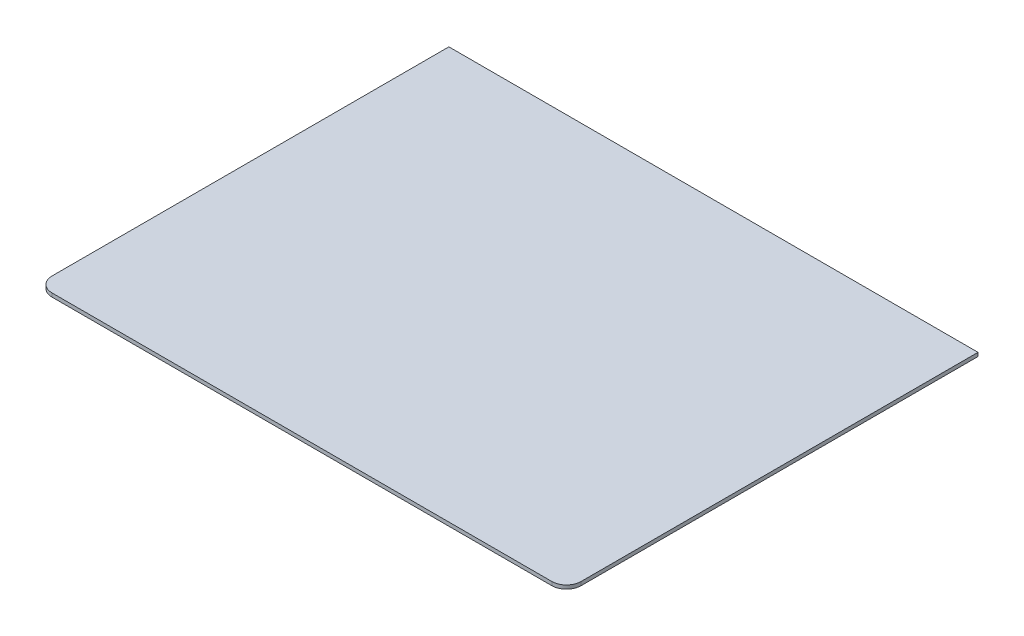
ISO-10303-21;
HEADER;
FILE_DESCRIPTION(('STEP AP214'),'2;1');
FILE_NAME('part.step','',(''),(''),'','','');
FILE_SCHEMA(('AUTOMOTIVE_DESIGN { 1 0 10303 214 1 1 1 1 }'));
ENDSEC;
DATA;
#1=APPLICATION_CONTEXT('core data for automotive mechanical design processes');
#2=APPLICATION_PROTOCOL_DEFINITION('international standard','automotive_design',2000,#1);
#3=PRODUCT_CONTEXT('',#1,'mechanical');
#4=PRODUCT('Part','Part','',(#3));
#5=PRODUCT_RELATED_PRODUCT_CATEGORY('part','',(#4));
#6=PRODUCT_DEFINITION_FORMATION('','',#4);
#7=PRODUCT_DEFINITION_CONTEXT('part definition',#1,'design');
#8=PRODUCT_DEFINITION('design','',#6,#7);
#9=PRODUCT_DEFINITION_SHAPE('','',#8);
#10=(LENGTH_UNIT() NAMED_UNIT(*) SI_UNIT(.MILLI.,.METRE.));
#11=(NAMED_UNIT(*) PLANE_ANGLE_UNIT() SI_UNIT($,.RADIAN.));
#12=(NAMED_UNIT(*) SI_UNIT($,.STERADIAN.) SOLID_ANGLE_UNIT());
#13=UNCERTAINTY_MEASURE_WITH_UNIT(LENGTH_MEASURE(1.E-05),#10,'distance_accuracy_value','');
#14=(GEOMETRIC_REPRESENTATION_CONTEXT(3) GLOBAL_UNCERTAINTY_ASSIGNED_CONTEXT((#13)) GLOBAL_UNIT_ASSIGNED_CONTEXT((#10,
#11,#12)) REPRESENTATION_CONTEXT('',''));
#15=CARTESIAN_POINT('',(0.,0.,0.));
#16=DIRECTION('',(0.,0.,1.));
#17=DIRECTION('',(1.,0.,0.));
#18=AXIS2_PLACEMENT_3D('',#15,#16,#17);
#19=CARTESIAN_POINT('',(228.6,3.175,177.8));
#20=DIRECTION('',(-1.,0.,0.));
#21=DIRECTION('',(0.,0.,1.));
#22=AXIS2_PLACEMENT_3D('',#19,#20,#21);
#23=PLANE('',#22);
#24=DIRECTION('',(0.,0.,-1.));
#25=VECTOR('',#24,1.);
#26=CARTESIAN_POINT('',(228.6,3.175,177.8));
#27=LINE('',#26,#25);
#28=CARTESIAN_POINT('',(228.6,3.175,165.1));
#29=VERTEX_POINT('',#28);
#30=CARTESIAN_POINT('',(228.6,3.175,-177.8));
#31=VERTEX_POINT('',#30);
#32=EDGE_CURVE('E93',#29,#31,#27,.T.);
#33=ORIENTED_EDGE('',*,*,#32,.F.);
#34=DIRECTION('',(0.,-1.,0.));
#35=VECTOR('',#34,1.);
#36=CARTESIAN_POINT('',(228.6,3.175,165.1));
#37=LINE('',#36,#35);
#38=CARTESIAN_POINT('',(228.6,0.,165.1));
#39=VERTEX_POINT('',#38);
#40=EDGE_CURVE('E11',#29,#39,#37,.T.);
#41=ORIENTED_EDGE('',*,*,#40,.T.);
#42=DIRECTION('',(0.,0.,-1.));
#43=VECTOR('',#42,1.);
#44=CARTESIAN_POINT('',(228.6,0.,177.8));
#45=LINE('',#44,#43);
#46=CARTESIAN_POINT('',(228.6,0.,-177.8));
#47=VERTEX_POINT('',#46);
#48=EDGE_CURVE('E114',#39,#47,#45,.T.);
#49=ORIENTED_EDGE('',*,*,#48,.T.);
#50=DIRECTION('',(0.,-1.,0.));
#51=VECTOR('',#50,1.);
#52=CARTESIAN_POINT('',(228.6,3.175,-177.8));
#53=LINE('',#52,#51);
#54=EDGE_CURVE('E107',#31,#47,#53,.T.);
#55=ORIENTED_EDGE('',*,*,#54,.F.);
#56=EDGE_LOOP('',(#33,#41,#49,#55));
#57=FACE_BOUND('',#56,.T.);
#58=ADVANCED_FACE('F39',(#57),#23,.F.);
#59=CARTESIAN_POINT('',(-228.6,3.175,-177.8));
#60=DIRECTION('',(0.,0.,1.));
#61=DIRECTION('',(1.,0.,0.));
#62=AXIS2_PLACEMENT_3D('',#59,#60,#61);
#63=PLANE('',#62);
#64=DIRECTION('',(-1.,0.,0.));
#65=VECTOR('',#64,1.);
#66=CARTESIAN_POINT('',(-228.6,0.,-177.8));
#67=LINE('',#66,#65);
#68=CARTESIAN_POINT('',(-228.6,0.,-177.8));
#69=VERTEX_POINT('',#68);
#70=EDGE_CURVE('E158',#47,#69,#67,.T.);
#71=ORIENTED_EDGE('',*,*,#70,.T.);
#72=DIRECTION('',(0.,-1.,0.));
#73=VECTOR('',#72,1.);
#74=CARTESIAN_POINT('',(-228.6,3.175,-177.8));
#75=LINE('',#74,#73);
#76=CARTESIAN_POINT('',(-228.6,3.175,-177.8));
#77=VERTEX_POINT('',#76);
#78=EDGE_CURVE('E109',#77,#69,#75,.T.);
#79=ORIENTED_EDGE('',*,*,#78,.F.);
#80=DIRECTION('',(-1.,0.,0.));
#81=VECTOR('',#80,1.);
#82=CARTESIAN_POINT('',(-228.6,3.175,-177.8));
#83=LINE('',#82,#81);
#84=EDGE_CURVE('E96',#31,#77,#83,.T.);
#85=ORIENTED_EDGE('',*,*,#84,.F.);
#86=ORIENTED_EDGE('',*,*,#54,.T.);
#87=EDGE_LOOP('',(#71,#79,#85,#86));
#88=FACE_BOUND('',#87,.T.);
#89=ADVANCED_FACE('F106',(#88),#63,.F.);
#90=CARTESIAN_POINT('',(-228.6,3.175,177.8));
#91=DIRECTION('',(1.,0.,0.));
#92=DIRECTION('',(0.,0.,-1.));
#93=AXIS2_PLACEMENT_3D('',#90,#91,#92);
#94=PLANE('',#93);
#95=DIRECTION('',(0.,0.,1.));
#96=VECTOR('',#95,1.);
#97=CARTESIAN_POINT('',(-228.6,0.,177.8));
#98=LINE('',#97,#96);
#99=CARTESIAN_POINT('',(-228.6,0.,165.1));
#100=VERTEX_POINT('',#99);
#101=EDGE_CURVE('E155',#69,#100,#98,.T.);
#102=ORIENTED_EDGE('',*,*,#101,.T.);
#103=DIRECTION('',(0.,-1.,0.));
#104=VECTOR('',#103,1.);
#105=CARTESIAN_POINT('',(-228.6,3.175,165.1));
#106=LINE('',#105,#104);
#107=CARTESIAN_POINT('',(-228.6,3.175,165.1));
#108=VERTEX_POINT('',#107);
#109=EDGE_CURVE('E63',#100,#108,#106,.F.);
#110=ORIENTED_EDGE('',*,*,#109,.T.);
#111=DIRECTION('',(0.,0.,1.));
#112=VECTOR('',#111,1.);
#113=CARTESIAN_POINT('',(-228.6,3.175,177.8));
#114=LINE('',#113,#112);
#115=EDGE_CURVE('E111',#77,#108,#114,.T.);
#116=ORIENTED_EDGE('',*,*,#115,.F.);
#117=ORIENTED_EDGE('',*,*,#78,.T.);
#118=EDGE_LOOP('',(#102,#110,#116,#117));
#119=FACE_BOUND('',#118,.T.);
#120=ADVANCED_FACE('F156',(#119),#94,.F.);
#121=CARTESIAN_POINT('',(-228.6,3.175,177.8));
#122=DIRECTION('',(0.,0.,-1.));
#123=DIRECTION('',(-1.,0.,0.));
#124=AXIS2_PLACEMENT_3D('',#121,#122,#123);
#125=PLANE('',#124);
#126=DIRECTION('',(1.,0.,0.));
#127=VECTOR('',#126,1.);
#128=CARTESIAN_POINT('',(-228.6,3.175,177.8));
#129=LINE('',#128,#127);
#130=CARTESIAN_POINT('',(-215.9,3.175,177.8));
#131=VERTEX_POINT('',#130);
#132=CARTESIAN_POINT('',(215.9,3.175,177.8));
#133=VERTEX_POINT('',#132);
#134=EDGE_CURVE('E123',#131,#133,#129,.T.);
#135=ORIENTED_EDGE('',*,*,#134,.F.);
#136=DIRECTION('',(0.,-1.,0.));
#137=VECTOR('',#136,1.);
#138=CARTESIAN_POINT('',(-215.9,3.175,177.8));
#139=LINE('',#138,#137);
#140=CARTESIAN_POINT('',(-215.9,0.,177.8));
#141=VERTEX_POINT('',#140);
#142=EDGE_CURVE('E121',#131,#141,#139,.T.);
#143=ORIENTED_EDGE('',*,*,#142,.T.);
#144=DIRECTION('',(1.,0.,0.));
#145=VECTOR('',#144,1.);
#146=CARTESIAN_POINT('',(-228.6,0.,177.8));
#147=LINE('',#146,#145);
#148=CARTESIAN_POINT('',(215.9,0.,177.8));
#149=VERTEX_POINT('',#148);
#150=EDGE_CURVE('E102',#141,#149,#147,.T.);
#151=ORIENTED_EDGE('',*,*,#150,.T.);
#152=DIRECTION('',(0.,-1.,0.));
#153=VECTOR('',#152,1.);
#154=CARTESIAN_POINT('',(215.9,3.175,177.8));
#155=LINE('',#154,#153);
#156=EDGE_CURVE('E117',#149,#133,#155,.F.);
#157=ORIENTED_EDGE('',*,*,#156,.T.);
#158=EDGE_LOOP('',(#135,#143,#151,#157));
#159=FACE_BOUND('',#158,.T.);
#160=ADVANCED_FACE('F145',(#159),#125,.F.);
#161=CARTESIAN_POINT('',(0.,3.175,0.));
#162=DIRECTION('',(0.,-1.,0.));
#163=DIRECTION('',(0.,0.,-1.));
#164=AXIS2_PLACEMENT_3D('',#161,#162,#163);
#165=PLANE('',#164);
#166=ORIENTED_EDGE('',*,*,#115,.T.);
#167=CARTESIAN_POINT('',(-215.9,3.175,165.1));
#168=DIRECTION('',(0.,-1.,0.));
#169=DIRECTION('',(0.,0.,-1.));
#170=AXIS2_PLACEMENT_3D('',#167,#168,#169);
#171=CIRCLE('',#170,12.7);
#172=EDGE_CURVE('E48',#108,#131,#171,.F.);
#173=ORIENTED_EDGE('',*,*,#172,.T.);
#174=ORIENTED_EDGE('',*,*,#134,.T.);
#175=CARTESIAN_POINT('',(215.9,3.175,165.1));
#176=DIRECTION('',(0.,-1.,0.));
#177=DIRECTION('',(0.,0.,-1.));
#178=AXIS2_PLACEMENT_3D('',#175,#176,#177);
#179=CIRCLE('',#178,12.7);
#180=EDGE_CURVE('E55',#133,#29,#179,.F.);
#181=ORIENTED_EDGE('',*,*,#180,.T.);
#182=ORIENTED_EDGE('',*,*,#32,.T.);
#183=ORIENTED_EDGE('',*,*,#84,.T.);
#184=EDGE_LOOP('',(#166,#173,#174,#181,#182,#183));
#185=FACE_BOUND('',#184,.T.);
#186=ADVANCED_FACE('F95',(#185),#165,.F.);
#187=CARTESIAN_POINT('',(0.,0.,0.));
#188=DIRECTION('',(0.,-1.,0.));
#189=DIRECTION('',(0.,0.,-1.));
#190=AXIS2_PLACEMENT_3D('',#187,#188,#189);
#191=PLANE('',#190);
#192=ORIENTED_EDGE('',*,*,#150,.F.);
#193=CARTESIAN_POINT('',(-215.9,0.,165.1));
#194=DIRECTION('',(0.,-1.,0.));
#195=DIRECTION('',(0.,0.,-1.));
#196=AXIS2_PLACEMENT_3D('',#193,#194,#195);
#197=CIRCLE('',#196,12.7);
#198=EDGE_CURVE('E133',#141,#100,#197,.T.);
#199=ORIENTED_EDGE('',*,*,#198,.T.);
#200=ORIENTED_EDGE('',*,*,#101,.F.);
#201=ORIENTED_EDGE('',*,*,#70,.F.);
#202=ORIENTED_EDGE('',*,*,#48,.F.);
#203=CARTESIAN_POINT('',(215.9,0.,165.1));
#204=DIRECTION('',(0.,-1.,0.));
#205=DIRECTION('',(0.,0.,-1.));
#206=AXIS2_PLACEMENT_3D('',#203,#204,#205);
#207=CIRCLE('',#206,12.7);
#208=EDGE_CURVE('E130',#39,#149,#207,.T.);
#209=ORIENTED_EDGE('',*,*,#208,.T.);
#210=EDGE_LOOP('',(#192,#199,#200,#201,#202,#209));
#211=FACE_BOUND('',#210,.T.);
#212=ADVANCED_FACE('F154',(#211),#191,.T.);
#213=CARTESIAN_POINT('',(-215.9,3.175,165.1));
#214=DIRECTION('',(0.,-1.,0.));
#215=DIRECTION('',(0.,0.,-1.));
#216=AXIS2_PLACEMENT_3D('',#213,#214,#215);
#217=CYLINDRICAL_SURFACE('',#216,12.7);
#218=ORIENTED_EDGE('',*,*,#172,.F.);
#219=ORIENTED_EDGE('',*,*,#109,.F.);
#220=ORIENTED_EDGE('',*,*,#198,.F.);
#221=ORIENTED_EDGE('',*,*,#142,.F.);
#222=EDGE_LOOP('',(#218,#219,#220,#221));
#223=FACE_BOUND('',#222,.T.);
#224=ADVANCED_FACE('F151',(#223),#217,.T.);
#225=CARTESIAN_POINT('',(215.9,3.175,165.1));
#226=DIRECTION('',(0.,-1.,0.));
#227=DIRECTION('',(0.,0.,-1.));
#228=AXIS2_PLACEMENT_3D('',#225,#226,#227);
#229=CYLINDRICAL_SURFACE('',#228,12.7);
#230=ORIENTED_EDGE('',*,*,#180,.F.);
#231=ORIENTED_EDGE('',*,*,#156,.F.);
#232=ORIENTED_EDGE('',*,*,#208,.F.);
#233=ORIENTED_EDGE('',*,*,#40,.F.);
#234=EDGE_LOOP('',(#230,#231,#232,#233));
#235=FACE_BOUND('',#234,.T.);
#236=ADVANCED_FACE('F41',(#235),#229,.T.);
#237=CLOSED_SHELL('',(#58,#89,#120,#160,#186,#212,#224,#236));
#238=MANIFOLD_SOLID_BREP('B2',#237);
#239=ADVANCED_BREP_SHAPE_REPRESENTATION('',(#18,#238),#14);
#240=SHAPE_DEFINITION_REPRESENTATION(#9,#239);
ENDSEC;
END-ISO-10303-21;
